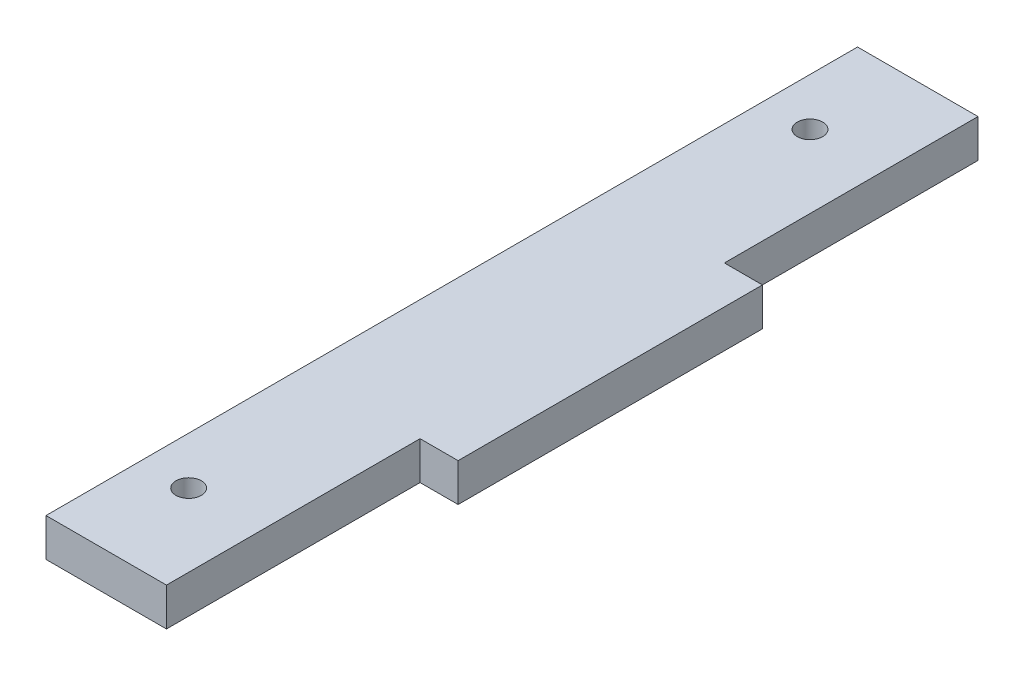
ISO-10303-21;
HEADER;
FILE_DESCRIPTION(('STEP AP214'),'2;1');
FILE_NAME('part.step','',(''),(''),'','','');
FILE_SCHEMA(('AUTOMOTIVE_DESIGN { 1 0 10303 214 1 1 1 1 }'));
ENDSEC;
DATA;
#1=APPLICATION_CONTEXT('core data for automotive mechanical design processes');
#2=APPLICATION_PROTOCOL_DEFINITION('international standard','automotive_design',2000,#1);
#3=PRODUCT_CONTEXT('',#1,'mechanical');
#4=PRODUCT('Part','Part','',(#3));
#5=PRODUCT_RELATED_PRODUCT_CATEGORY('part','',(#4));
#6=PRODUCT_DEFINITION_FORMATION('','',#4);
#7=PRODUCT_DEFINITION_CONTEXT('part definition',#1,'design');
#8=PRODUCT_DEFINITION('design','',#6,#7);
#9=PRODUCT_DEFINITION_SHAPE('','',#8);
#10=(LENGTH_UNIT() NAMED_UNIT(*) SI_UNIT(.MILLI.,.METRE.));
#11=(NAMED_UNIT(*) PLANE_ANGLE_UNIT() SI_UNIT($,.RADIAN.));
#12=(NAMED_UNIT(*) SI_UNIT($,.STERADIAN.) SOLID_ANGLE_UNIT());
#13=UNCERTAINTY_MEASURE_WITH_UNIT(LENGTH_MEASURE(1.E-05),#10,'distance_accuracy_value','');
#14=(GEOMETRIC_REPRESENTATION_CONTEXT(3) GLOBAL_UNCERTAINTY_ASSIGNED_CONTEXT((#13)) GLOBAL_UNIT_ASSIGNED_CONTEXT((#10,
#11,#12)) REPRESENTATION_CONTEXT('',''));
#15=CARTESIAN_POINT('',(0.,0.,0.));
#16=DIRECTION('',(0.,0.,1.));
#17=DIRECTION('',(1.,0.,0.));
#18=AXIS2_PLACEMENT_3D('',#15,#16,#17);
#19=CARTESIAN_POINT('',(4.37157981243104,6.,0.));
#20=DIRECTION('',(1.,0.,0.));
#21=DIRECTION('',(0.,0.,-1.));
#22=AXIS2_PLACEMENT_3D('',#19,#20,#21);
#23=PLANE('',#22);
#24=DIRECTION('',(0.,0.,1.));
#25=VECTOR('',#24,1.);
#26=CARTESIAN_POINT('',(4.37157981243104,0.,0.));
#27=LINE('',#26,#25);
#28=CARTESIAN_POINT('',(4.37157981243105,0.,29.206779661017));
#29=VERTEX_POINT('',#28);
#30=CARTESIAN_POINT('',(4.37157981243105,0.,69.206779661017));
#31=VERTEX_POINT('',#30);
#32=EDGE_CURVE('E130',#29,#31,#27,.T.);
#33=ORIENTED_EDGE('',*,*,#32,.F.);
#34=DIRECTION('',(0.,-1.,0.));
#35=VECTOR('',#34,1.);
#36=CARTESIAN_POINT('',(4.37157981243105,6.,29.206779661017));
#37=LINE('',#36,#35);
#38=CARTESIAN_POINT('',(4.37157981243105,6.,29.206779661017));
#39=VERTEX_POINT('',#38);
#40=EDGE_CURVE('E11',#39,#29,#37,.T.);
#41=ORIENTED_EDGE('',*,*,#40,.F.);
#42=DIRECTION('',(0.,0.,1.));
#43=VECTOR('',#42,1.);
#44=CARTESIAN_POINT('',(4.37157981243104,6.,0.));
#45=LINE('',#44,#43);
#46=CARTESIAN_POINT('',(4.37157981243105,6.,69.206779661017));
#47=VERTEX_POINT('',#46);
#48=EDGE_CURVE('E150',#39,#47,#45,.T.);
#49=ORIENTED_EDGE('',*,*,#48,.T.);
#50=DIRECTION('',(0.,-1.,0.));
#51=VECTOR('',#50,1.);
#52=CARTESIAN_POINT('',(4.37157981243105,6.,69.206779661017));
#53=LINE('',#52,#51);
#54=EDGE_CURVE('E85',#47,#31,#53,.T.);
#55=ORIENTED_EDGE('',*,*,#54,.T.);
#56=EDGE_LOOP('',(#33,#41,#49,#55));
#57=FACE_BOUND('',#56,.T.);
#58=ADVANCED_FACE('F35',(#57),#23,.T.);
#59=CARTESIAN_POINT('',(0.,6.,29.206779661017));
#60=DIRECTION('',(0.,0.,-1.));
#61=DIRECTION('',(-1.,0.,0.));
#62=AXIS2_PLACEMENT_3D('',#59,#60,#61);
#63=PLANE('',#62);
#64=DIRECTION('',(1.,0.,0.));
#65=VECTOR('',#64,1.);
#66=CARTESIAN_POINT('',(0.,0.,29.206779661017));
#67=LINE('',#66,#65);
#68=CARTESIAN_POINT('',(10.371579812431,0.,29.206779661017));
#69=VERTEX_POINT('',#68);
#70=EDGE_CURVE('E133',#29,#69,#67,.T.);
#71=ORIENTED_EDGE('',*,*,#70,.T.);
#72=DIRECTION('',(0.,-1.,0.));
#73=VECTOR('',#72,1.);
#74=CARTESIAN_POINT('',(10.371579812431,6.,29.206779661017));
#75=LINE('',#74,#73);
#76=CARTESIAN_POINT('',(10.371579812431,6.,29.206779661017));
#77=VERTEX_POINT('',#76);
#78=EDGE_CURVE('E43',#77,#69,#75,.T.);
#79=ORIENTED_EDGE('',*,*,#78,.F.);
#80=DIRECTION('',(1.,0.,0.));
#81=VECTOR('',#80,1.);
#82=CARTESIAN_POINT('',(0.,6.,29.206779661017));
#83=LINE('',#82,#81);
#84=EDGE_CURVE('E174',#39,#77,#83,.T.);
#85=ORIENTED_EDGE('',*,*,#84,.F.);
#86=ORIENTED_EDGE('',*,*,#40,.T.);
#87=EDGE_LOOP('',(#71,#79,#85,#86));
#88=FACE_BOUND('',#87,.T.);
#89=ADVANCED_FACE('F166',(#88),#63,.F.);
#90=CARTESIAN_POINT('',(10.371579812431,6.,0.));
#91=DIRECTION('',(1.,0.,0.));
#92=DIRECTION('',(0.,0.,-1.));
#93=AXIS2_PLACEMENT_3D('',#90,#91,#92);
#94=PLANE('',#93);
#95=DIRECTION('',(0.,0.,1.));
#96=VECTOR('',#95,1.);
#97=CARTESIAN_POINT('',(10.371579812431,0.,0.));
#98=LINE('',#97,#96);
#99=CARTESIAN_POINT('',(10.371579812431,0.,-18.793220338983));
#100=VERTEX_POINT('',#99);
#101=EDGE_CURVE('E137',#100,#69,#98,.T.);
#102=ORIENTED_EDGE('',*,*,#101,.F.);
#103=DIRECTION('',(0.,-1.,0.));
#104=VECTOR('',#103,1.);
#105=CARTESIAN_POINT('',(10.371579812431,6.,-18.793220338983));
#106=LINE('',#105,#104);
#107=CARTESIAN_POINT('',(10.371579812431,6.,-18.793220338983));
#108=VERTEX_POINT('',#107);
#109=EDGE_CURVE('E156',#108,#100,#106,.T.);
#110=ORIENTED_EDGE('',*,*,#109,.F.);
#111=DIRECTION('',(0.,0.,1.));
#112=VECTOR('',#111,1.);
#113=CARTESIAN_POINT('',(10.371579812431,6.,0.));
#114=LINE('',#113,#112);
#115=EDGE_CURVE('E163',#108,#77,#114,.T.);
#116=ORIENTED_EDGE('',*,*,#115,.T.);
#117=ORIENTED_EDGE('',*,*,#78,.T.);
#118=EDGE_LOOP('',(#102,#110,#116,#117));
#119=FACE_BOUND('',#118,.T.);
#120=ADVANCED_FACE('F161',(#119),#94,.T.);
#121=CARTESIAN_POINT('',(0.,6.,-18.793220338983));
#122=DIRECTION('',(0.,0.,-1.));
#123=DIRECTION('',(-1.,0.,0.));
#124=AXIS2_PLACEMENT_3D('',#121,#122,#123);
#125=PLANE('',#124);
#126=DIRECTION('',(1.,0.,0.));
#127=VECTOR('',#126,1.);
#128=CARTESIAN_POINT('',(0.,0.,-18.793220338983));
#129=LINE('',#128,#127);
#130=CARTESIAN_POINT('',(4.37157981243104,0.,-18.793220338983));
#131=VERTEX_POINT('',#130);
#132=EDGE_CURVE('E140',#131,#100,#129,.T.);
#133=ORIENTED_EDGE('',*,*,#132,.F.);
#134=DIRECTION('',(0.,-1.,0.));
#135=VECTOR('',#134,1.);
#136=CARTESIAN_POINT('',(4.37157981243104,6.,-18.793220338983));
#137=LINE('',#136,#135);
#138=CARTESIAN_POINT('',(4.37157981243104,6.,-18.793220338983));
#139=VERTEX_POINT('',#138);
#140=EDGE_CURVE('E154',#139,#131,#137,.T.);
#141=ORIENTED_EDGE('',*,*,#140,.F.);
#142=DIRECTION('',(1.,0.,0.));
#143=VECTOR('',#142,1.);
#144=CARTESIAN_POINT('',(0.,6.,-18.793220338983));
#145=LINE('',#144,#143);
#146=EDGE_CURVE('E125',#139,#108,#145,.T.);
#147=ORIENTED_EDGE('',*,*,#146,.T.);
#148=ORIENTED_EDGE('',*,*,#109,.T.);
#149=EDGE_LOOP('',(#133,#141,#147,#148));
#150=FACE_BOUND('',#149,.T.);
#151=ADVANCED_FACE('F172',(#150),#125,.T.);
#152=CARTESIAN_POINT('',(4.37157981243103,6.,0.));
#153=DIRECTION('',(1.,0.,0.));
#154=DIRECTION('',(0.,0.,-1.));
#155=AXIS2_PLACEMENT_3D('',#152,#153,#154);
#156=PLANE('',#155);
#157=DIRECTION('',(0.,0.,1.));
#158=VECTOR('',#157,1.);
#159=CARTESIAN_POINT('',(4.37157981243103,0.,0.));
#160=LINE('',#159,#158);
#161=CARTESIAN_POINT('',(4.37157981243105,0.,-58.793220338983));
#162=VERTEX_POINT('',#161);
#163=EDGE_CURVE('E143',#162,#131,#160,.T.);
#164=ORIENTED_EDGE('',*,*,#163,.F.);
#165=DIRECTION('',(0.,-1.,0.));
#166=VECTOR('',#165,1.);
#167=CARTESIAN_POINT('',(4.37157981243105,6.,-58.793220338983));
#168=LINE('',#167,#166);
#169=CARTESIAN_POINT('',(4.37157981243105,6.,-58.793220338983));
#170=VERTEX_POINT('',#169);
#171=EDGE_CURVE('E113',#170,#162,#168,.T.);
#172=ORIENTED_EDGE('',*,*,#171,.F.);
#173=DIRECTION('',(0.,0.,1.));
#174=VECTOR('',#173,1.);
#175=CARTESIAN_POINT('',(4.37157981243103,6.,0.));
#176=LINE('',#175,#174);
#177=EDGE_CURVE('E123',#170,#139,#176,.T.);
#178=ORIENTED_EDGE('',*,*,#177,.T.);
#179=ORIENTED_EDGE('',*,*,#140,.T.);
#180=EDGE_LOOP('',(#164,#172,#178,#179));
#181=FACE_BOUND('',#180,.T.);
#182=ADVANCED_FACE('F231',(#181),#156,.T.);
#183=CARTESIAN_POINT('',(0.,6.,-58.793220338983));
#184=DIRECTION('',(0.,0.,-1.));
#185=DIRECTION('',(-1.,0.,0.));
#186=AXIS2_PLACEMENT_3D('',#183,#184,#185);
#187=PLANE('',#186);
#188=DIRECTION('',(1.,0.,0.));
#189=VECTOR('',#188,1.);
#190=CARTESIAN_POINT('',(0.,0.,-58.793220338983));
#191=LINE('',#190,#189);
#192=CARTESIAN_POINT('',(-14.628420187569,0.,-58.793220338983));
#193=VERTEX_POINT('',#192);
#194=EDGE_CURVE('E112',#193,#162,#191,.T.);
#195=ORIENTED_EDGE('',*,*,#194,.F.);
#196=DIRECTION('',(0.,-1.,0.));
#197=VECTOR('',#196,1.);
#198=CARTESIAN_POINT('',(-14.628420187569,6.,-58.793220338983));
#199=LINE('',#198,#197);
#200=CARTESIAN_POINT('',(-14.628420187569,6.,-58.793220338983));
#201=VERTEX_POINT('',#200);
#202=EDGE_CURVE('E106',#201,#193,#199,.T.);
#203=ORIENTED_EDGE('',*,*,#202,.F.);
#204=DIRECTION('',(1.,0.,0.));
#205=VECTOR('',#204,1.);
#206=CARTESIAN_POINT('',(0.,6.,-58.793220338983));
#207=LINE('',#206,#205);
#208=EDGE_CURVE('E110',#201,#170,#207,.T.);
#209=ORIENTED_EDGE('',*,*,#208,.T.);
#210=ORIENTED_EDGE('',*,*,#171,.T.);
#211=EDGE_LOOP('',(#195,#203,#209,#210));
#212=FACE_BOUND('',#211,.T.);
#213=ADVANCED_FACE('F108',(#212),#187,.T.);
#214=CARTESIAN_POINT('',(-14.628420187569,6.,0.));
#215=DIRECTION('',(1.,0.,0.));
#216=DIRECTION('',(0.,0.,-1.));
#217=AXIS2_PLACEMENT_3D('',#214,#215,#216);
#218=PLANE('',#217);
#219=DIRECTION('',(0.,0.,1.));
#220=VECTOR('',#219,1.);
#221=CARTESIAN_POINT('',(-14.628420187569,0.,0.));
#222=LINE('',#221,#220);
#223=CARTESIAN_POINT('',(-14.628420187569,0.,69.206779661017));
#224=VERTEX_POINT('',#223);
#225=EDGE_CURVE('E78',#193,#224,#222,.T.);
#226=ORIENTED_EDGE('',*,*,#225,.T.);
#227=DIRECTION('',(0.,-1.,0.));
#228=VECTOR('',#227,1.);
#229=CARTESIAN_POINT('',(-14.628420187569,6.,69.206779661017));
#230=LINE('',#229,#228);
#231=CARTESIAN_POINT('',(-14.628420187569,6.,69.206779661017));
#232=VERTEX_POINT('',#231);
#233=EDGE_CURVE('E114',#232,#224,#230,.T.);
#234=ORIENTED_EDGE('',*,*,#233,.F.);
#235=DIRECTION('',(0.,0.,1.));
#236=VECTOR('',#235,1.);
#237=CARTESIAN_POINT('',(-14.628420187569,6.,0.));
#238=LINE('',#237,#236);
#239=EDGE_CURVE('E116',#201,#232,#238,.T.);
#240=ORIENTED_EDGE('',*,*,#239,.F.);
#241=ORIENTED_EDGE('',*,*,#202,.T.);
#242=EDGE_LOOP('',(#226,#234,#240,#241));
#243=FACE_BOUND('',#242,.T.);
#244=ADVANCED_FACE('F117',(#243),#218,.F.);
#245=CARTESIAN_POINT('',(0.,6.,69.206779661017));
#246=DIRECTION('',(0.,0.,-1.));
#247=DIRECTION('',(-1.,0.,0.));
#248=AXIS2_PLACEMENT_3D('',#245,#246,#247);
#249=PLANE('',#248);
#250=DIRECTION('',(1.,0.,0.));
#251=VECTOR('',#250,1.);
#252=CARTESIAN_POINT('',(0.,0.,69.206779661017));
#253=LINE('',#252,#251);
#254=EDGE_CURVE('E148',#224,#31,#253,.T.);
#255=ORIENTED_EDGE('',*,*,#254,.T.);
#256=ORIENTED_EDGE('',*,*,#54,.F.);
#257=DIRECTION('',(1.,0.,0.));
#258=VECTOR('',#257,1.);
#259=CARTESIAN_POINT('',(0.,6.,69.206779661017));
#260=LINE('',#259,#258);
#261=EDGE_CURVE('E51',#232,#47,#260,.T.);
#262=ORIENTED_EDGE('',*,*,#261,.F.);
#263=ORIENTED_EDGE('',*,*,#233,.T.);
#264=EDGE_LOOP('',(#255,#256,#262,#263));
#265=FACE_BOUND('',#264,.T.);
#266=ADVANCED_FACE('F202',(#265),#249,.F.);
#267=CARTESIAN_POINT('',(0.,6.,0.));
#268=DIRECTION('',(0.,1.,0.));
#269=DIRECTION('',(0.,0.,1.));
#270=AXIS2_PLACEMENT_3D('',#267,#268,#269);
#271=PLANE('',#270);
#272=CARTESIAN_POINT('',(-7.12842018756897,6.,-43.793220338983));
#273=DIRECTION('',(0.,1.,0.));
#274=DIRECTION('',(0.,0.,1.));
#275=AXIS2_PLACEMENT_3D('',#272,#273,#274);
#276=CIRCLE('',#275,2.);
#277=CARTESIAN_POINT('',(-7.12842018756897,6.,-41.793220338983));
#278=VERTEX_POINT('',#277);
#279=EDGE_CURVE('E185',#278,#278,#276,.T.);
#280=ORIENTED_EDGE('',*,*,#279,.F.);
#281=EDGE_LOOP('',(#280));
#282=FACE_BOUND('',#281,.T.);
#283=CARTESIAN_POINT('',(-7.12842018756897,6.,54.206779661017));
#284=DIRECTION('',(0.,1.,0.));
#285=DIRECTION('',(0.,0.,1.));
#286=AXIS2_PLACEMENT_3D('',#283,#284,#285);
#287=CIRCLE('',#286,2.);
#288=CARTESIAN_POINT('',(-7.12842018756897,6.,56.206779661017));
#289=VERTEX_POINT('',#288);
#290=EDGE_CURVE('E179',#289,#289,#287,.T.);
#291=ORIENTED_EDGE('',*,*,#290,.F.);
#292=EDGE_LOOP('',(#291));
#293=FACE_BOUND('',#292,.T.);
#294=ORIENTED_EDGE('',*,*,#48,.F.);
#295=ORIENTED_EDGE('',*,*,#84,.T.);
#296=ORIENTED_EDGE('',*,*,#115,.F.);
#297=ORIENTED_EDGE('',*,*,#146,.F.);
#298=ORIENTED_EDGE('',*,*,#177,.F.);
#299=ORIENTED_EDGE('',*,*,#208,.F.);
#300=ORIENTED_EDGE('',*,*,#239,.T.);
#301=ORIENTED_EDGE('',*,*,#261,.T.);
#302=EDGE_LOOP('',(#294,#295,#296,#297,#298,#299,#300,#301));
#303=FACE_BOUND('',#302,.T.);
#304=ADVANCED_FACE('F120',(#282,#293,#303),#271,.T.);
#305=CARTESIAN_POINT('',(0.,0.,0.));
#306=DIRECTION('',(0.,1.,0.));
#307=DIRECTION('',(0.,0.,1.));
#308=AXIS2_PLACEMENT_3D('',#305,#306,#307);
#309=PLANE('',#308);
#310=CARTESIAN_POINT('',(-7.12842018756897,0.,-43.793220338983));
#311=DIRECTION('',(0.,1.,0.));
#312=DIRECTION('',(0.,0.,1.));
#313=AXIS2_PLACEMENT_3D('',#310,#311,#312);
#314=CIRCLE('',#313,2.);
#315=CARTESIAN_POINT('',(-7.12842018756897,0.,-41.793220338983));
#316=VERTEX_POINT('',#315);
#317=EDGE_CURVE('E182',#316,#316,#314,.T.);
#318=ORIENTED_EDGE('',*,*,#317,.T.);
#319=EDGE_LOOP('',(#318));
#320=FACE_BOUND('',#319,.T.);
#321=CARTESIAN_POINT('',(-7.12842018756897,0.,54.206779661017));
#322=DIRECTION('',(0.,1.,0.));
#323=DIRECTION('',(0.,0.,1.));
#324=AXIS2_PLACEMENT_3D('',#321,#322,#323);
#325=CIRCLE('',#324,2.);
#326=CARTESIAN_POINT('',(-7.12842018756897,0.,56.206779661017));
#327=VERTEX_POINT('',#326);
#328=EDGE_CURVE('E134',#327,#327,#325,.T.);
#329=ORIENTED_EDGE('',*,*,#328,.T.);
#330=EDGE_LOOP('',(#329));
#331=FACE_BOUND('',#330,.T.);
#332=ORIENTED_EDGE('',*,*,#32,.T.);
#333=ORIENTED_EDGE('',*,*,#254,.F.);
#334=ORIENTED_EDGE('',*,*,#225,.F.);
#335=ORIENTED_EDGE('',*,*,#194,.T.);
#336=ORIENTED_EDGE('',*,*,#163,.T.);
#337=ORIENTED_EDGE('',*,*,#132,.T.);
#338=ORIENTED_EDGE('',*,*,#101,.T.);
#339=ORIENTED_EDGE('',*,*,#70,.F.);
#340=EDGE_LOOP('',(#332,#333,#334,#335,#336,#337,#338,#339));
#341=FACE_BOUND('',#340,.T.);
#342=ADVANCED_FACE('F168',(#320,#331,#341),#309,.F.);
#343=CARTESIAN_POINT('',(-7.12842018756897,0.,54.206779661017));
#344=DIRECTION('',(0.,1.,0.));
#345=DIRECTION('',(0.,0.,1.));
#346=AXIS2_PLACEMENT_3D('',#343,#344,#345);
#347=CYLINDRICAL_SURFACE('',#346,2.);
#348=ORIENTED_EDGE('',*,*,#328,.F.);
#349=EDGE_LOOP('',(#348));
#350=FACE_BOUND('',#349,.T.);
#351=ORIENTED_EDGE('',*,*,#290,.T.);
#352=EDGE_LOOP('',(#351));
#353=FACE_BOUND('',#352,.T.);
#354=ADVANCED_FACE('F196',(#350,#353),#347,.F.);
#355=CARTESIAN_POINT('',(-7.12842018756897,0.,-43.793220338983));
#356=DIRECTION('',(0.,1.,0.));
#357=DIRECTION('',(0.,0.,1.));
#358=AXIS2_PLACEMENT_3D('',#355,#356,#357);
#359=CYLINDRICAL_SURFACE('',#358,2.);
#360=ORIENTED_EDGE('',*,*,#317,.F.);
#361=EDGE_LOOP('',(#360));
#362=FACE_BOUND('',#361,.T.);
#363=ORIENTED_EDGE('',*,*,#279,.T.);
#364=EDGE_LOOP('',(#363));
#365=FACE_BOUND('',#364,.T.);
#366=ADVANCED_FACE('F193',(#362,#365),#359,.F.);
#367=CLOSED_SHELL('',(#58,#89,#120,#151,#182,#213,#244,#266,#304,#342,#354,#366));
#368=MANIFOLD_SOLID_BREP('B2',#367);
#369=ADVANCED_BREP_SHAPE_REPRESENTATION('',(#18,#368),#14);
#370=SHAPE_DEFINITION_REPRESENTATION(#9,#369);
ENDSEC;
END-ISO-10303-21;
